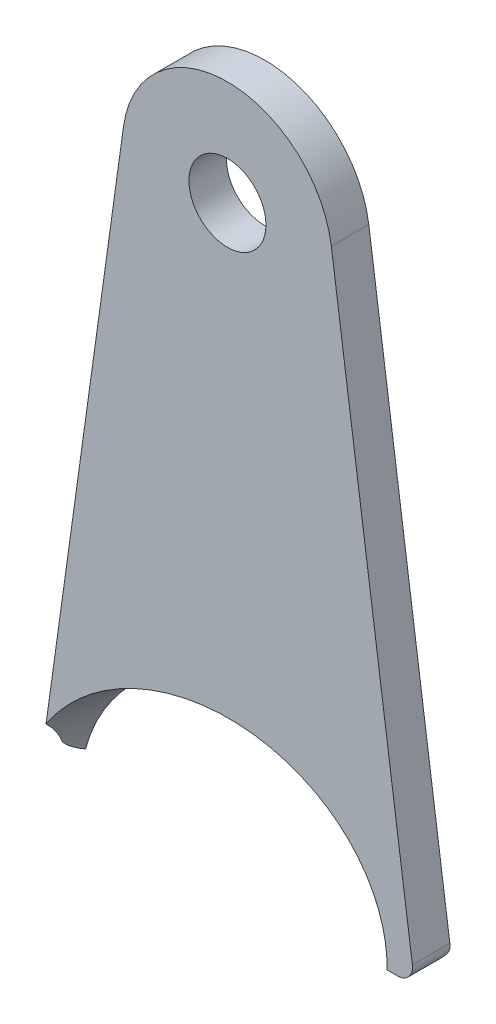
ISO-10303-21;
HEADER;
FILE_DESCRIPTION(('STEP AP214'),'2;1');
FILE_NAME('part.step','',(''),(''),'','','');
FILE_SCHEMA(('AUTOMOTIVE_DESIGN { 1 0 10303 214 1 1 1 1 }'));
ENDSEC;
DATA;
#1=APPLICATION_CONTEXT('core data for automotive mechanical design processes');
#2=APPLICATION_PROTOCOL_DEFINITION('international standard','automotive_design',2000,#1);
#3=PRODUCT_CONTEXT('',#1,'mechanical');
#4=PRODUCT('Part','Part','',(#3));
#5=PRODUCT_RELATED_PRODUCT_CATEGORY('part','',(#4));
#6=PRODUCT_DEFINITION_FORMATION('','',#4);
#7=PRODUCT_DEFINITION_CONTEXT('part definition',#1,'design');
#8=PRODUCT_DEFINITION('design','',#6,#7);
#9=PRODUCT_DEFINITION_SHAPE('','',#8);
#10=(LENGTH_UNIT() NAMED_UNIT(*) SI_UNIT(.MILLI.,.METRE.));
#11=(NAMED_UNIT(*) PLANE_ANGLE_UNIT() SI_UNIT($,.RADIAN.));
#12=(NAMED_UNIT(*) SI_UNIT($,.STERADIAN.) SOLID_ANGLE_UNIT());
#13=UNCERTAINTY_MEASURE_WITH_UNIT(LENGTH_MEASURE(1.E-05),#10,'distance_accuracy_value','');
#14=(GEOMETRIC_REPRESENTATION_CONTEXT(3) GLOBAL_UNCERTAINTY_ASSIGNED_CONTEXT((#13)) GLOBAL_UNIT_ASSIGNED_CONTEXT((#10,
#11,#12)) REPRESENTATION_CONTEXT('',''));
#15=CARTESIAN_POINT('',(0.,0.,0.));
#16=DIRECTION('',(0.,0.,1.));
#17=DIRECTION('',(1.,0.,0.));
#18=AXIS2_PLACEMENT_3D('',#15,#16,#17);
#19=CARTESIAN_POINT('',(0.,-49.53,3.175));
#20=DIRECTION('',(0.,1.,0.));
#21=DIRECTION('',(-1.,0.,0.));
#22=AXIS2_PLACEMENT_3D('',#19,#20,#21);
#23=PLANE('',#22);
#24=CARTESIAN_POINT('',(2.29948606295113,-49.53,-3.5392684453267));
#25=DIRECTION('',(0.,1.,0.));
#26=DIRECTION('',(0.544815380436231,0.,-0.838556021527557));
#27=AXIS2_PLACEMENT_3D('',#24,#25,#26);
#28=ELLIPSE('',#27,60.3015967233945,13.081);
#29=CARTESIAN_POINT('',(14.4158368159501,-49.53,1.80692645308146));
#30=VERTEX_POINT('',#29);
#31=CARTESIAN_POINT('',(13.536098007669,-49.53,3.175));
#32=VERTEX_POINT('',#31);
#33=EDGE_CURVE('E247',#30,#32,#28,.F.);
#34=ORIENTED_EDGE('',*,*,#33,.F.);
#35=DIRECTION('',(0.,0.,-1.));
#36=VECTOR('',#35,1.);
#37=CARTESIAN_POINT('',(14.4158368159501,-49.53,3.175));
#38=LINE('',#37,#36);
#39=CARTESIAN_POINT('',(14.4158368159501,-49.53,3.175));
#40=VERTEX_POINT('',#39);
#41=EDGE_CURVE('E154',#30,#40,#38,.F.);
#42=ORIENTED_EDGE('',*,*,#41,.T.);
#43=DIRECTION('',(1.,0.,0.));
#44=VECTOR('',#43,1.);
#45=CARTESIAN_POINT('',(0.,-49.53,3.175));
#46=LINE('',#45,#44);
#47=EDGE_CURVE('E241',#32,#40,#46,.T.);
#48=ORIENTED_EDGE('',*,*,#47,.F.);
#49=EDGE_LOOP('',(#34,#42,#48));
#50=FACE_BOUND('',#49,.T.);
#51=ADVANCED_FACE('F138',(#50),#23,.F.);
#52=CARTESIAN_POINT('',(-8.80499106591057,1.22647149548415,3.175));
#53=DIRECTION('',(-0.990437690203663,0.137960798142199,0.));
#54=DIRECTION('',(-0.1379607981422,-0.990437690203663,0.));
#55=AXIS2_PLACEMENT_3D('',#52,#53,#54);
#56=PLANE('',#55);
#57=DIRECTION('',(0.1379607981422,0.990437690203663,0.));
#58=VECTOR('',#57,1.);
#59=CARTESIAN_POINT('',(-8.80499106591057,1.22647149548415,0.));
#60=LINE('',#59,#58);
#61=CARTESIAN_POINT('',(-15.6736926825088,-48.0847897863594,0.));
#62=VERTEX_POINT('',#61);
#63=CARTESIAN_POINT('',(-8.80499106591057,1.22647149548415,0.));
#64=VERTEX_POINT('',#63);
#65=EDGE_CURVE('E200',#62,#64,#60,.T.);
#66=ORIENTED_EDGE('',*,*,#65,.F.);
#67=DIRECTION('',(0.,0.,-1.));
#68=VECTOR('',#67,1.);
#69=CARTESIAN_POINT('',(-15.6736926825088,-48.0847897863594,1.05722255039288));
#70=LINE('',#69,#68);
#71=CARTESIAN_POINT('',(-15.6736926825088,-48.0847897863594,1.55390905754415));
#72=VERTEX_POINT('',#71);
#73=EDGE_CURVE('E12',#62,#72,#70,.F.);
#74=ORIENTED_EDGE('',*,*,#73,.T.);
#75=CARTESIAN_POINT('',(-16.969769766165,-57.3894880075112,26.1191279327682));
#76=DIRECTION('',(-0.990437690203663,0.137960798142199,0.));
#77=DIRECTION('',(0.0458188324460975,0.328939084050286,-0.943238948293292));
#78=AXIS2_PLACEMENT_3D('',#75,#76,#77);
#79=ELLIPSE('',#78,26.3289639669939,13.081);
#80=CARTESIAN_POINT('',(-15.3741347869044,-45.9342264799712,3.175));
#81=VERTEX_POINT('',#80);
#82=EDGE_CURVE('E243',#72,#81,#79,.F.);
#83=ORIENTED_EDGE('',*,*,#82,.T.);
#84=DIRECTION('',(0.1379607981422,0.990437690203663,0.));
#85=VECTOR('',#84,1.);
#86=CARTESIAN_POINT('',(-8.80499106591057,1.22647149548415,3.175));
#87=LINE('',#86,#85);
#88=CARTESIAN_POINT('',(-8.80499106591057,1.22647149548415,3.175));
#89=VERTEX_POINT('',#88);
#90=EDGE_CURVE('E219',#81,#89,#87,.T.);
#91=ORIENTED_EDGE('',*,*,#90,.T.);
#92=DIRECTION('',(0.,0.,-1.));
#93=VECTOR('',#92,1.);
#94=CARTESIAN_POINT('',(-8.80499106591057,1.22647149548415,3.175));
#95=LINE('',#94,#93);
#96=EDGE_CURVE('E216',#89,#64,#95,.T.);
#97=ORIENTED_EDGE('',*,*,#96,.T.);
#98=EDGE_LOOP('',(#66,#74,#83,#91,#97));
#99=FACE_BOUND('',#98,.T.);
#100=ADVANCED_FACE('F217',(#99),#56,.T.);
#101=CARTESIAN_POINT('',(8.80499106591057,1.22647149548416,3.175));
#102=DIRECTION('',(-0.990437690203663,-0.1379607981422,0.));
#103=DIRECTION('',(0.1379607981422,-0.990437690203663,0.));
#104=AXIS2_PLACEMENT_3D('',#101,#102,#103);
#105=PLANE('',#104);
#106=DIRECTION('',(-0.1379607981422,0.990437690203663,0.));
#107=VECTOR('',#106,1.);
#108=CARTESIAN_POINT('',(8.80499106591057,1.22647149548416,3.175));
#109=LINE('',#108,#107);
#110=CARTESIAN_POINT('',(15.6736926825088,-48.0847897863594,3.175));
#111=VERTEX_POINT('',#110);
#112=CARTESIAN_POINT('',(8.80499106591057,1.22647149548416,3.175));
#113=VERTEX_POINT('',#112);
#114=EDGE_CURVE('E239',#111,#113,#109,.T.);
#115=ORIENTED_EDGE('',*,*,#114,.F.);
#116=DIRECTION('',(0.,0.,-1.));
#117=VECTOR('',#116,1.);
#118=CARTESIAN_POINT('',(15.6736926825088,-48.0847897863594,3.175));
#119=LINE('',#118,#117);
#120=CARTESIAN_POINT('',(15.6736926825088,-48.0847897863594,0.));
#121=VERTEX_POINT('',#120);
#122=EDGE_CURVE('E249',#111,#121,#119,.T.);
#123=ORIENTED_EDGE('',*,*,#122,.T.);
#124=DIRECTION('',(-0.1379607981422,0.990437690203663,0.));
#125=VECTOR('',#124,1.);
#126=CARTESIAN_POINT('',(8.80499106591057,1.22647149548416,0.));
#127=LINE('',#126,#125);
#128=CARTESIAN_POINT('',(8.80499106591057,1.22647149548416,0.));
#129=VERTEX_POINT('',#128);
#130=EDGE_CURVE('E223',#121,#129,#127,.T.);
#131=ORIENTED_EDGE('',*,*,#130,.T.);
#132=DIRECTION('',(0.,0.,-1.));
#133=VECTOR('',#132,1.);
#134=CARTESIAN_POINT('',(8.80499106591057,1.22647149548416,3.175));
#135=LINE('',#134,#133);
#136=EDGE_CURVE('E228',#113,#129,#135,.T.);
#137=ORIENTED_EDGE('',*,*,#136,.F.);
#138=EDGE_LOOP('',(#115,#123,#131,#137));
#139=FACE_BOUND('',#138,.T.);
#140=ADVANCED_FACE('F297',(#139),#105,.F.);
#141=CARTESIAN_POINT('',(0.,0.,3.175));
#142=DIRECTION('',(0.,0.,-1.));
#143=DIRECTION('',(-1.,0.,0.));
#144=AXIS2_PLACEMENT_3D('',#141,#142,#143);
#145=CYLINDRICAL_SURFACE('',#144,8.89);
#146=CARTESIAN_POINT('',(0.,0.,0.));
#147=DIRECTION('',(0.,0.,1.));
#148=DIRECTION('',(1.,0.,0.));
#149=AXIS2_PLACEMENT_3D('',#146,#147,#148);
#150=CIRCLE('',#149,8.89);
#151=EDGE_CURVE('E206',#129,#64,#150,.T.);
#152=ORIENTED_EDGE('',*,*,#151,.T.);
#153=ORIENTED_EDGE('',*,*,#96,.F.);
#154=CARTESIAN_POINT('',(0.,0.,3.175));
#155=DIRECTION('',(0.,0.,1.));
#156=DIRECTION('',(1.,0.,0.));
#157=AXIS2_PLACEMENT_3D('',#154,#155,#156);
#158=CIRCLE('',#157,8.89);
#159=EDGE_CURVE('E213',#113,#89,#158,.T.);
#160=ORIENTED_EDGE('',*,*,#159,.F.);
#161=ORIENTED_EDGE('',*,*,#136,.T.);
#162=EDGE_LOOP('',(#152,#153,#160,#161));
#163=FACE_BOUND('',#162,.T.);
#164=ADVANCED_FACE('F226',(#163),#145,.T.);
#165=CARTESIAN_POINT('',(0.,0.,3.175));
#166=DIRECTION('',(0.,0.,-1.));
#167=DIRECTION('',(-1.,0.,0.));
#168=AXIS2_PLACEMENT_3D('',#165,#166,#167);
#169=CYLINDRICAL_SURFACE('',#168,3.2639);
#170=CARTESIAN_POINT('',(0.,0.,3.175));
#171=DIRECTION('',(0.,0.,1.));
#172=DIRECTION('',(1.,0.,0.));
#173=AXIS2_PLACEMENT_3D('',#170,#171,#172);
#174=CIRCLE('',#173,3.2639);
#175=CARTESIAN_POINT('',(3.2639,0.,3.175));
#176=VERTEX_POINT('',#175);
#177=EDGE_CURVE('E230',#176,#176,#174,.T.);
#178=ORIENTED_EDGE('',*,*,#177,.T.);
#179=EDGE_LOOP('',(#178));
#180=FACE_BOUND('',#179,.T.);
#181=CARTESIAN_POINT('',(0.,0.,0.));
#182=DIRECTION('',(0.,0.,1.));
#183=DIRECTION('',(1.,0.,0.));
#184=AXIS2_PLACEMENT_3D('',#181,#182,#183);
#185=CIRCLE('',#184,3.2639);
#186=CARTESIAN_POINT('',(3.2639,0.,0.));
#187=VERTEX_POINT('',#186);
#188=EDGE_CURVE('E212',#187,#187,#185,.T.);
#189=ORIENTED_EDGE('',*,*,#188,.F.);
#190=EDGE_LOOP('',(#189));
#191=FACE_BOUND('',#190,.T.);
#192=ADVANCED_FACE('F275',(#180,#191),#169,.F.);
#193=CARTESIAN_POINT('',(0.,0.,3.175));
#194=DIRECTION('',(0.,0.,1.));
#195=DIRECTION('',(1.,0.,0.));
#196=AXIS2_PLACEMENT_3D('',#193,#194,#195);
#197=PLANE('',#196);
#198=ORIENTED_EDGE('',*,*,#47,.T.);
#199=CARTESIAN_POINT('',(14.4158368159501,-48.26,3.175));
#200=DIRECTION('',(0.,0.,1.));
#201=DIRECTION('',(1.,0.,0.));
#202=AXIS2_PLACEMENT_3D('',#199,#200,#201);
#203=CIRCLE('',#202,1.27);
#204=EDGE_CURVE('E147',#40,#111,#203,.T.);
#205=ORIENTED_EDGE('',*,*,#204,.T.);
#206=ORIENTED_EDGE('',*,*,#114,.T.);
#207=ORIENTED_EDGE('',*,*,#159,.T.);
#208=ORIENTED_EDGE('',*,*,#90,.F.);
#209=CARTESIAN_POINT('',(-2.06281845038118,-51.3092840736403,3.17500000000001));
#210=DIRECTION('',(0.,0.,1.));
#211=DIRECTION('',(0.925940325935365,0.377669846303235,0.));
#212=AXIS2_PLACEMENT_3D('',#209,#210,#211);
#213=ELLIPSE('',#212,15.97994949691,13.081);
#214=EDGE_CURVE('E237',#81,#32,#213,.F.);
#215=ORIENTED_EDGE('',*,*,#214,.T.);
#216=EDGE_LOOP('',(#198,#205,#206,#207,#208,#215));
#217=FACE_BOUND('',#216,.T.);
#218=ORIENTED_EDGE('',*,*,#177,.F.);
#219=EDGE_LOOP('',(#218));
#220=FACE_BOUND('',#219,.T.);
#221=ADVANCED_FACE('F277',(#217,#220),#197,.T.);
#222=CARTESIAN_POINT('',(0.,0.,0.));
#223=DIRECTION('',(0.,0.,1.));
#224=DIRECTION('',(1.,0.,0.));
#225=AXIS2_PLACEMENT_3D('',#222,#223,#224);
#226=PLANE('',#225);
#227=ORIENTED_EDGE('',*,*,#130,.F.);
#228=CARTESIAN_POINT('',(14.4158368159501,-48.26,0.));
#229=DIRECTION('',(0.,0.,1.));
#230=DIRECTION('',(1.,0.,0.));
#231=AXIS2_PLACEMENT_3D('',#228,#229,#230);
#232=CIRCLE('',#231,1.27);
#233=CARTESIAN_POINT('',(15.5985429736097,-48.7227160518442,0.));
#234=VERTEX_POINT('',#233);
#235=EDGE_CURVE('E255',#121,#234,#232,.F.);
#236=ORIENTED_EDGE('',*,*,#235,.T.);
#237=CARTESIAN_POINT('',(-2.91433543964104E-13,-50.4679076854591,0.));
#238=DIRECTION('',(0.,0.,1.));
#239=DIRECTION('',(0.925940325935365,0.377669846303235,0.));
#240=AXIS2_PLACEMENT_3D('',#237,#238,#239);
#241=ELLIPSE('',#240,15.97994949691,13.081);
#242=CARTESIAN_POINT('',(-15.192139618196,-49.265113903607,0.));
#243=VERTEX_POINT('',#242);
#244=EDGE_CURVE('E250',#243,#234,#241,.F.);
#245=ORIENTED_EDGE('',*,*,#244,.F.);
#246=CARTESIAN_POINT('',(-14.4158368159501,-48.26,0.));
#247=DIRECTION('',(0.,0.,1.));
#248=DIRECTION('',(1.,0.,0.));
#249=AXIS2_PLACEMENT_3D('',#246,#247,#248);
#250=CIRCLE('',#249,1.27);
#251=EDGE_CURVE('E209',#243,#62,#250,.F.);
#252=ORIENTED_EDGE('',*,*,#251,.T.);
#253=ORIENTED_EDGE('',*,*,#65,.T.);
#254=ORIENTED_EDGE('',*,*,#151,.F.);
#255=EDGE_LOOP('',(#227,#236,#245,#252,#253,#254));
#256=FACE_BOUND('',#255,.T.);
#257=ORIENTED_EDGE('',*,*,#188,.T.);
#258=EDGE_LOOP('',(#257));
#259=FACE_BOUND('',#258,.T.);
#260=ADVANCED_FACE('F203',(#256,#259),#226,.F.);
#261=CARTESIAN_POINT('',(-123.025911317866,-100.647358474362,189.356105653458));
#262=DIRECTION('',(0.531842232493453,0.216926262500196,-0.818588319226506));
#263=DIRECTION('',(0.455152304592375,0.741924356505789,0.492325734496705));
#264=AXIS2_PLACEMENT_3D('',#261,#262,#263);
#265=CYLINDRICAL_SURFACE('',#264,13.081);
#266=ORIENTED_EDGE('',*,*,#244,.T.);
#267=CARTESIAN_POINT('',(15.5985429736097,-48.7227160518442,0.));
#268=CARTESIAN_POINT('',(15.5849790204176,-48.7573635317901,0.0203132637624028));
#269=CARTESIAN_POINT('',(15.5702702725219,-48.7904982878331,0.042263023194842));
#270=CARTESIAN_POINT('',(15.5390390928705,-48.853768344322,0.0888037029797986));
#271=CARTESIAN_POINT('',(15.5225224272385,-48.8839126281061,0.113386221366045));
#272=CARTESIAN_POINT('',(15.4713827240298,-48.969285250378,0.189526644876898));
#273=CARTESIAN_POINT('',(15.4347094328241,-49.0205485510745,0.244162013930129));
#274=CARTESIAN_POINT('',(15.3675086701168,-49.1021912720584,0.344608237808919));
#275=CARTESIAN_POINT('',(15.3376779172537,-49.134609758274,0.389299895223384));
#276=CARTESIAN_POINT('',(15.2766900123238,-49.1946997899529,0.480934929945499));
#277=CARTESIAN_POINT('',(15.2455325099722,-49.2223700719869,0.527878902323245));
#278=CARTESIAN_POINT('',(15.1818652706504,-49.2738042061103,0.624095964985921));
#279=CARTESIAN_POINT('',(15.1493426463485,-49.2975073251761,0.673392595286365));
#280=CARTESIAN_POINT('',(15.0836418244389,-49.3409656938379,0.77328050342955));
#281=CARTESIAN_POINT('',(15.0504634311991,-49.3607197451822,0.823872168983501));
#282=CARTESIAN_POINT('',(14.9671082722597,-49.4055219883038,0.951339703037112));
#283=CARTESIAN_POINT('',(14.9166541024185,-49.4283440167753,1.02881913398742));
#284=CARTESIAN_POINT('',(14.8151840219021,-49.4667989021399,1.18522476958226));
#285=CARTESIAN_POINT('',(14.7641677330766,-49.4824265731784,1.26415197533553));
#286=CARTESIAN_POINT('',(14.663566701692,-49.5066449380436,1.42026640254924));
#287=CARTESIAN_POINT('',(14.6139897732245,-49.5154492653155,1.49742599171248));
#288=CARTESIAN_POINT('',(14.5148678008083,-49.5271053508344,1.65202775484764));
#289=CARTESIAN_POINT('',(14.4653228509543,-49.5299674177491,1.7294692055735));
#290=CARTESIAN_POINT('',(14.4158368159501,-49.53,1.80692645308146));
#291=B_SPLINE_CURVE_WITH_KNOTS('',3,(#267,#268,#269,#270,#271,#272,#273,#274,#275,#276,#277,
#278,#279,#280,#281,#282,#283,#284,#285,#286,#287,#288,#289,#290),.UNSPECIFIED.,.F.,.F.,(4,2,2,
2,2,2,2,2,2,2,2,4),(0.,0.126969423952509,0.253545085870096,0.502647834818923,0.690696607781905,
0.878795340509337,1.06955233383047,1.2603671203187,1.54572248674671,1.83128322291477,
2.1074949745328,2.38322715065276),.UNSPECIFIED.);
#292=EDGE_CURVE('E162',#234,#30,#291,.T.);
#293=ORIENTED_EDGE('',*,*,#292,.T.);
#294=ORIENTED_EDGE('',*,*,#33,.T.);
#295=ORIENTED_EDGE('',*,*,#214,.F.);
#296=ORIENTED_EDGE('',*,*,#82,.F.);
#297=CARTESIAN_POINT('',(-15.6736926825088,-48.0847897863594,1.55390905754415));
#298=CARTESIAN_POINT('',(-15.6784371873488,-48.1189182486166,1.53739528471185));
#299=CARTESIAN_POINT('',(-15.6816774422343,-48.1522733293865,1.51905950509573));
#300=CARTESIAN_POINT('',(-15.6855345205484,-48.217242966715,1.47953256215148));
#301=CARTESIAN_POINT('',(-15.6861615240902,-48.2488638028561,1.45835281141586));
#302=CARTESIAN_POINT('',(-15.685214535185,-48.3100177997879,1.4140910530015));
#303=CARTESIAN_POINT('',(-15.6836704913902,-48.339573577939,1.39103898224972));
#304=CARTESIAN_POINT('',(-15.6787402784425,-48.3971509957232,1.34322278880797));
#305=CARTESIAN_POINT('',(-15.6753518612579,-48.4251707171503,1.31845660908017));
#306=CARTESIAN_POINT('',(-15.664703311819,-48.4946443086467,1.25367683114361));
#307=CARTESIAN_POINT('',(-15.6563391925421,-48.5350625082218,1.21273343201227));
#308=CARTESIAN_POINT('',(-15.63655485712,-48.6126269487979,1.12859018387588));
#309=CARTESIAN_POINT('',(-15.6251338169207,-48.6497723039441,1.08538972896715));
#310=CARTESIAN_POINT('',(-15.586927284624,-48.7572741468586,0.952679383978449));
#311=CARTESIAN_POINT('',(-15.5563009606304,-48.8231374985494,0.860607238989125));
#312=CARTESIAN_POINT('',(-15.4999952176118,-48.9229485168676,0.706151824405907));
#313=CARTESIAN_POINT('',(-15.4764298616952,-48.95991649861,0.644854778865958));
#314=CARTESIAN_POINT('',(-15.4268438855107,-49.0298021732177,0.521276921483251));
#315=CARTESIAN_POINT('',(-15.4008326082607,-49.0627342540003,0.459000553740492));
#316=CARTESIAN_POINT('',(-15.3455804076619,-49.1262103339142,0.331030142560379));
#317=CARTESIAN_POINT('',(-15.3162512645524,-49.1566032193918,0.265299954470904));
#318=CARTESIAN_POINT('',(-15.2556058721676,-49.213629568904,0.133126844828573));
#319=CARTESIAN_POINT('',(-15.2242896526174,-49.2402630891567,0.0666839339498424));
#320=CARTESIAN_POINT('',(-15.1921396181962,-49.2651139036074,1.12138733603347E-13));
#321=B_SPLINE_CURVE_WITH_KNOTS('',3,(#297,#298,#299,#300,#301,#302,#303,#304,#305,#306,#307,
#308,#309,#310,#311,#312,#313,#314,#315,#316,#317,#318,#319,#320),.UNSPECIFIED.,.F.,.F.,(4,2,2,
2,2,2,2,2,2,2,2,4),(0.,0.114418152396976,0.228390161430236,0.340805310577444,0.453357785795665,
0.62747905962369,0.801647318685801,1.15232504866087,1.37829256701001,1.60342951232393,
1.8377013957659,2.07196977550912),.UNSPECIFIED.);
#322=EDGE_CURVE('E257',#72,#243,#321,.T.);
#323=ORIENTED_EDGE('',*,*,#322,.T.);
#324=EDGE_LOOP('',(#266,#293,#294,#295,#296,#323));
#325=FACE_BOUND('',#324,.T.);
#326=ADVANCED_FACE('F269',(#325),#265,.F.);
#327=CARTESIAN_POINT('',(14.4158368159501,-48.26,3.175));
#328=DIRECTION('',(0.,0.,-1.));
#329=DIRECTION('',(-1.,0.,0.));
#330=AXIS2_PLACEMENT_3D('',#327,#328,#329);
#331=CYLINDRICAL_SURFACE('',#330,1.27);
#332=ORIENTED_EDGE('',*,*,#204,.F.);
#333=ORIENTED_EDGE('',*,*,#41,.F.);
#334=ORIENTED_EDGE('',*,*,#292,.F.);
#335=ORIENTED_EDGE('',*,*,#235,.F.);
#336=ORIENTED_EDGE('',*,*,#122,.F.);
#337=EDGE_LOOP('',(#332,#333,#334,#335,#336));
#338=FACE_BOUND('',#337,.T.);
#339=ADVANCED_FACE('F274',(#338),#331,.T.);
#340=CARTESIAN_POINT('',(-14.4158368159501,-48.26,3.175));
#341=DIRECTION('',(0.,0.,1.));
#342=DIRECTION('',(1.,0.,0.));
#343=AXIS2_PLACEMENT_3D('',#340,#341,#342);
#344=CYLINDRICAL_SURFACE('',#343,1.27);
#345=ORIENTED_EDGE('',*,*,#322,.F.);
#346=ORIENTED_EDGE('',*,*,#73,.F.);
#347=ORIENTED_EDGE('',*,*,#251,.F.);
#348=EDGE_LOOP('',(#345,#346,#347));
#349=FACE_BOUND('',#348,.T.);
#350=ADVANCED_FACE('F140',(#349),#344,.T.);
#351=CLOSED_SHELL('',(#51,#100,#140,#164,#192,#221,#260,#326,#339,#350));
#352=MANIFOLD_SOLID_BREP('B2',#351);
#353=ADVANCED_BREP_SHAPE_REPRESENTATION('',(#18,#352),#14);
#354=SHAPE_DEFINITION_REPRESENTATION(#9,#353);
ENDSEC;
END-ISO-10303-21;
